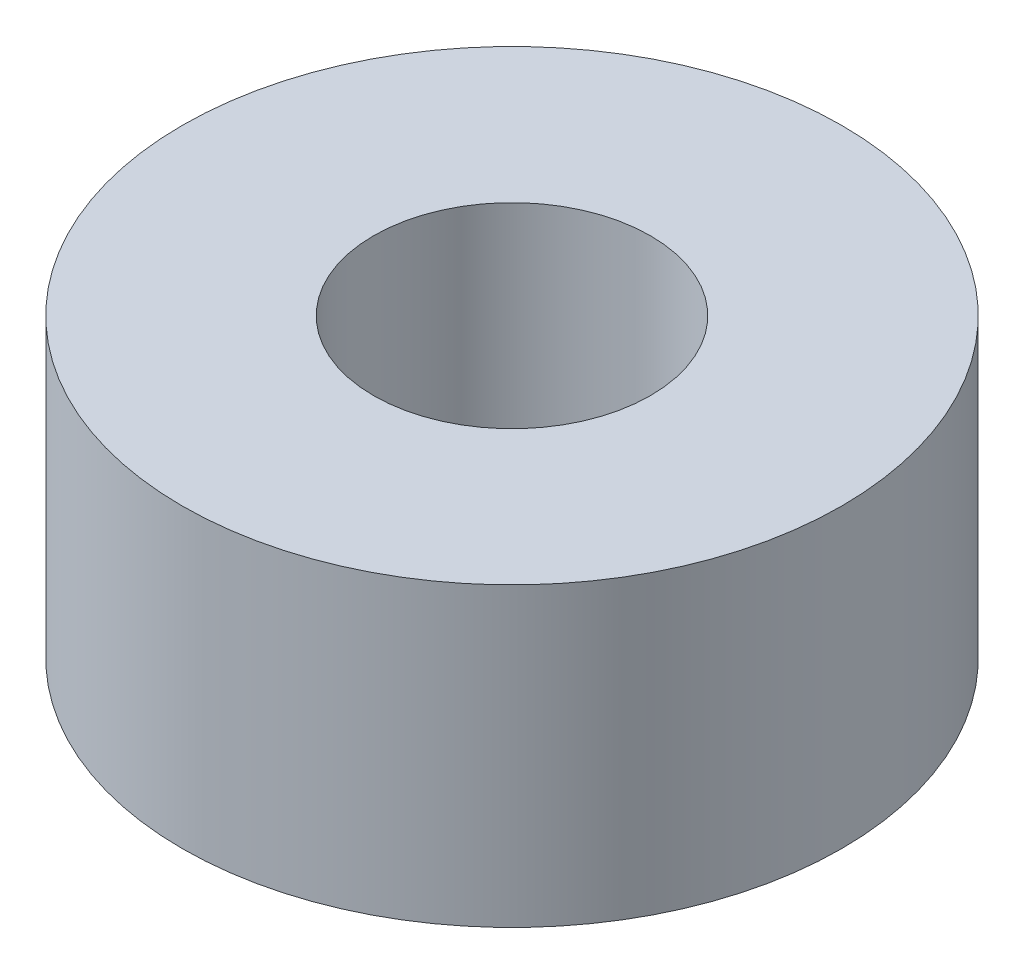
ISO-10303-21;
HEADER;
FILE_DESCRIPTION(('STEP AP214'),'2;1');
FILE_NAME('part.step','',(''),(''),'','','');
FILE_SCHEMA(('AUTOMOTIVE_DESIGN { 1 0 10303 214 1 1 1 1 }'));
ENDSEC;
DATA;
#1=APPLICATION_CONTEXT('core data for automotive mechanical design processes');
#2=APPLICATION_PROTOCOL_DEFINITION('international standard','automotive_design',2000,#1);
#3=PRODUCT_CONTEXT('',#1,'mechanical');
#4=PRODUCT('Part','Part','',(#3));
#5=PRODUCT_RELATED_PRODUCT_CATEGORY('part','',(#4));
#6=PRODUCT_DEFINITION_FORMATION('','',#4);
#7=PRODUCT_DEFINITION_CONTEXT('part definition',#1,'design');
#8=PRODUCT_DEFINITION('design','',#6,#7);
#9=PRODUCT_DEFINITION_SHAPE('','',#8);
#10=(LENGTH_UNIT() NAMED_UNIT(*) SI_UNIT(.MILLI.,.METRE.));
#11=(NAMED_UNIT(*) PLANE_ANGLE_UNIT() SI_UNIT($,.RADIAN.));
#12=(NAMED_UNIT(*) SI_UNIT($,.STERADIAN.) SOLID_ANGLE_UNIT());
#13=UNCERTAINTY_MEASURE_WITH_UNIT(LENGTH_MEASURE(1.E-05),#10,'distance_accuracy_value','');
#14=(GEOMETRIC_REPRESENTATION_CONTEXT(3) GLOBAL_UNCERTAINTY_ASSIGNED_CONTEXT((#13)) GLOBAL_UNIT_ASSIGNED_CONTEXT((#10,
#11,#12)) REPRESENTATION_CONTEXT('',''));
#15=CARTESIAN_POINT('',(0.,0.,0.));
#16=DIRECTION('',(0.,0.,1.));
#17=DIRECTION('',(1.,0.,0.));
#18=AXIS2_PLACEMENT_3D('',#15,#16,#17);
#19=CARTESIAN_POINT('',(0.,4.5,0.));
#20=DIRECTION('',(0.,1.,0.));
#21=DIRECTION('',(0.,0.,1.));
#22=AXIS2_PLACEMENT_3D('',#19,#20,#21);
#23=PLANE('',#22);
#24=CARTESIAN_POINT('',(0.,4.5,0.));
#25=DIRECTION('',(0.,1.,0.));
#26=DIRECTION('',(0.,0.,1.));
#27=AXIS2_PLACEMENT_3D('',#24,#25,#26);
#28=CIRCLE('',#27,5.);
#29=CARTESIAN_POINT('',(0.,4.5,5.));
#30=VERTEX_POINT('',#29);
#31=EDGE_CURVE('E10',#30,#30,#28,.T.);
#32=ORIENTED_EDGE('',*,*,#31,.T.);
#33=EDGE_LOOP('',(#32));
#34=FACE_BOUND('',#33,.T.);
#35=CARTESIAN_POINT('',(0.,4.5,0.));
#36=DIRECTION('',(0.,1.,0.));
#37=DIRECTION('',(0.,0.,1.));
#38=AXIS2_PLACEMENT_3D('',#35,#36,#37);
#39=CIRCLE('',#38,2.1);
#40=CARTESIAN_POINT('',(0.,4.5,2.1));
#41=VERTEX_POINT('',#40);
#42=EDGE_CURVE('E52',#41,#41,#39,.T.);
#43=ORIENTED_EDGE('',*,*,#42,.F.);
#44=EDGE_LOOP('',(#43));
#45=FACE_BOUND('',#44,.T.);
#46=ADVANCED_FACE('F39',(#34,#45),#23,.T.);
#47=CARTESIAN_POINT('',(0.,0.,0.));
#48=DIRECTION('',(0.,1.,0.));
#49=DIRECTION('',(0.,0.,1.));
#50=AXIS2_PLACEMENT_3D('',#47,#48,#49);
#51=PLANE('',#50);
#52=CARTESIAN_POINT('',(0.,0.,0.));
#53=DIRECTION('',(0.,1.,0.));
#54=DIRECTION('',(0.,0.,1.));
#55=AXIS2_PLACEMENT_3D('',#52,#53,#54);
#56=CIRCLE('',#55,5.);
#57=CARTESIAN_POINT('',(0.,0.,5.));
#58=VERTEX_POINT('',#57);
#59=EDGE_CURVE('E43',#58,#58,#56,.T.);
#60=ORIENTED_EDGE('',*,*,#59,.F.);
#61=EDGE_LOOP('',(#60));
#62=FACE_BOUND('',#61,.T.);
#63=CARTESIAN_POINT('',(0.,0.,0.));
#64=DIRECTION('',(0.,1.,0.));
#65=DIRECTION('',(0.,0.,1.));
#66=AXIS2_PLACEMENT_3D('',#63,#64,#65);
#67=CIRCLE('',#66,2.1);
#68=CARTESIAN_POINT('',(0.,0.,2.1));
#69=VERTEX_POINT('',#68);
#70=EDGE_CURVE('E54',#69,#69,#67,.T.);
#71=ORIENTED_EDGE('',*,*,#70,.T.);
#72=EDGE_LOOP('',(#71));
#73=FACE_BOUND('',#72,.T.);
#74=ADVANCED_FACE('F66',(#62,#73),#51,.F.);
#75=CARTESIAN_POINT('',(0.,4.5,0.));
#76=DIRECTION('',(0.,-1.,0.));
#77=DIRECTION('',(0.,0.,-1.));
#78=AXIS2_PLACEMENT_3D('',#75,#76,#77);
#79=CYLINDRICAL_SURFACE('',#78,5.);
#80=ORIENTED_EDGE('',*,*,#31,.F.);
#81=EDGE_LOOP('',(#80));
#82=FACE_BOUND('',#81,.T.);
#83=ORIENTED_EDGE('',*,*,#59,.T.);
#84=EDGE_LOOP('',(#83));
#85=FACE_BOUND('',#84,.T.);
#86=ADVANCED_FACE('F41',(#82,#85),#79,.T.);
#87=CARTESIAN_POINT('',(0.,4.5,0.));
#88=DIRECTION('',(0.,-1.,0.));
#89=DIRECTION('',(0.,0.,-1.));
#90=AXIS2_PLACEMENT_3D('',#87,#88,#89);
#91=CYLINDRICAL_SURFACE('',#90,2.1);
#92=ORIENTED_EDGE('',*,*,#42,.T.);
#93=EDGE_LOOP('',(#92));
#94=FACE_BOUND('',#93,.T.);
#95=ORIENTED_EDGE('',*,*,#70,.F.);
#96=EDGE_LOOP('',(#95));
#97=FACE_BOUND('',#96,.T.);
#98=ADVANCED_FACE('F62',(#94,#97),#91,.F.);
#99=CLOSED_SHELL('',(#46,#74,#86,#98));
#100=MANIFOLD_SOLID_BREP('B2',#99);
#101=ADVANCED_BREP_SHAPE_REPRESENTATION('',(#18,#100),#14);
#102=SHAPE_DEFINITION_REPRESENTATION(#9,#101);
ENDSEC;
END-ISO-10303-21;
